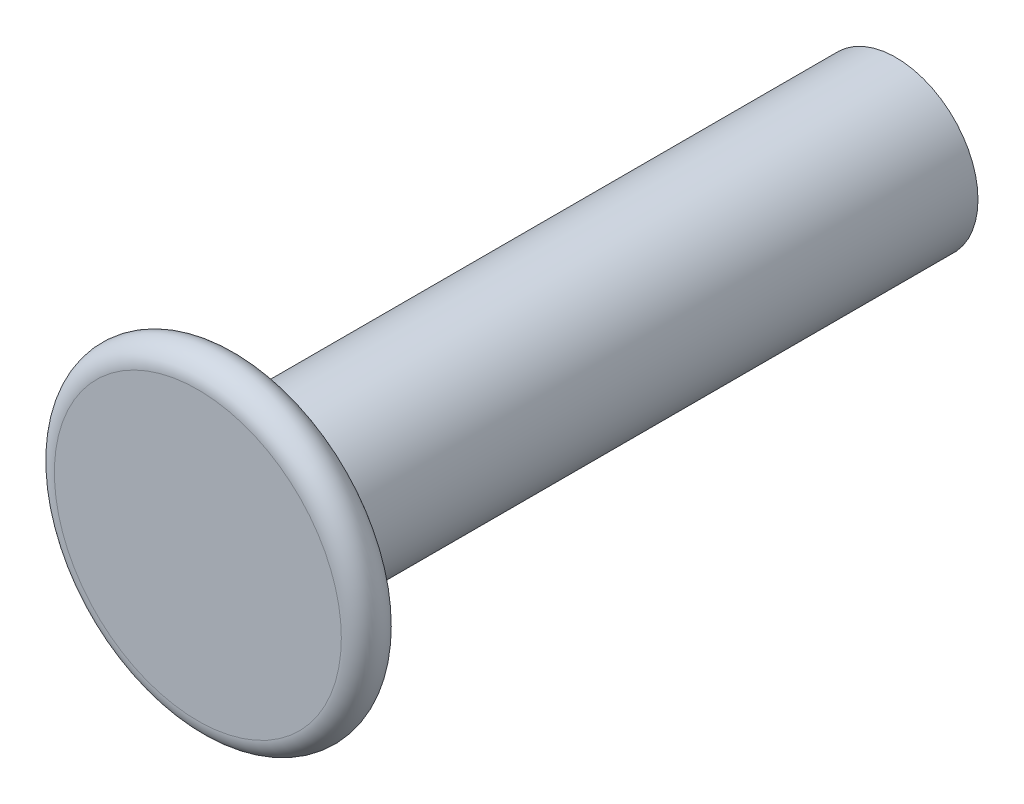
ISO-10303-21;
HEADER;
FILE_DESCRIPTION(('STEP AP214'),'2;1');
FILE_NAME('part.step','',(''),(''),'','','');
FILE_SCHEMA(('AUTOMOTIVE_DESIGN { 1 0 10303 214 1 1 1 1 }'));
ENDSEC;
DATA;
#1=APPLICATION_CONTEXT('core data for automotive mechanical design processes');
#2=APPLICATION_PROTOCOL_DEFINITION('international standard','automotive_design',2000,#1);
#3=PRODUCT_CONTEXT('',#1,'mechanical');
#4=PRODUCT('Part','Part','',(#3));
#5=PRODUCT_RELATED_PRODUCT_CATEGORY('part','',(#4));
#6=PRODUCT_DEFINITION_FORMATION('','',#4);
#7=PRODUCT_DEFINITION_CONTEXT('part definition',#1,'design');
#8=PRODUCT_DEFINITION('design','',#6,#7);
#9=PRODUCT_DEFINITION_SHAPE('','',#8);
#10=(LENGTH_UNIT() NAMED_UNIT(*) SI_UNIT(.MILLI.,.METRE.));
#11=(NAMED_UNIT(*) PLANE_ANGLE_UNIT() SI_UNIT($,.RADIAN.));
#12=(NAMED_UNIT(*) SI_UNIT($,.STERADIAN.) SOLID_ANGLE_UNIT());
#13=UNCERTAINTY_MEASURE_WITH_UNIT(LENGTH_MEASURE(1.E-05),#10,'distance_accuracy_value','');
#14=(GEOMETRIC_REPRESENTATION_CONTEXT(3) GLOBAL_UNCERTAINTY_ASSIGNED_CONTEXT((#13)) GLOBAL_UNIT_ASSIGNED_CONTEXT((#10,
#11,#12)) REPRESENTATION_CONTEXT('',''));
#15=CARTESIAN_POINT('',(0.,0.,0.));
#16=DIRECTION('',(0.,0.,1.));
#17=DIRECTION('',(1.,0.,0.));
#18=AXIS2_PLACEMENT_3D('',#15,#16,#17);
#19=CARTESIAN_POINT('',(0.,0.,-27.0002));
#20=DIRECTION('',(0.,0.,1.));
#21=DIRECTION('',(1.,0.,0.));
#22=AXIS2_PLACEMENT_3D('',#19,#20,#21);
#23=PLANE('',#22);
#24=CARTESIAN_POINT('',(0.,0.,-27.0002));
#25=DIRECTION('',(0.,0.,1.));
#26=DIRECTION('',(1.,0.,0.));
#27=AXIS2_PLACEMENT_3D('',#24,#25,#26);
#28=CIRCLE('',#27,3.175);
#29=CARTESIAN_POINT('',(3.175,0.,-27.0002));
#30=VERTEX_POINT('',#29);
#31=EDGE_CURVE('E10',#30,#30,#28,.T.);
#32=ORIENTED_EDGE('',*,*,#31,.F.);
#33=EDGE_LOOP('',(#32));
#34=FACE_BOUND('',#33,.T.);
#35=ADVANCED_FACE('F31',(#34),#23,.F.);
#36=CARTESIAN_POINT('',(0.,0.,0.));
#37=DIRECTION('',(0.,0.,1.));
#38=DIRECTION('',(1.,0.,0.));
#39=AXIS2_PLACEMENT_3D('',#36,#37,#38);
#40=CYLINDRICAL_SURFACE('',#39,3.175);
#41=CARTESIAN_POINT('',(0.,0.,-1.6002));
#42=DIRECTION('',(0.,0.,1.));
#43=DIRECTION('',(1.,0.,0.));
#44=AXIS2_PLACEMENT_3D('',#41,#42,#43);
#45=CIRCLE('',#44,3.175);
#46=CARTESIAN_POINT('',(3.175,0.,-1.6002));
#47=VERTEX_POINT('',#46);
#48=EDGE_CURVE('E37',#47,#47,#45,.T.);
#49=ORIENTED_EDGE('',*,*,#48,.F.);
#50=EDGE_LOOP('',(#49));
#51=FACE_BOUND('',#50,.T.);
#52=ORIENTED_EDGE('',*,*,#31,.T.);
#53=EDGE_LOOP('',(#52));
#54=FACE_BOUND('',#53,.T.);
#55=ADVANCED_FACE('F61',(#51,#54),#40,.T.);
#56=CARTESIAN_POINT('',(-5.5499,0.,-1.6002));
#57=DIRECTION('',(0.,0.,1.));
#58=DIRECTION('',(1.,0.,0.));
#59=AXIS2_PLACEMENT_3D('',#56,#57,#58);
#60=PLANE('',#59);
#61=CARTESIAN_POINT('',(0.,0.,-1.6002));
#62=DIRECTION('',(0.,0.,1.));
#63=DIRECTION('',(1.,0.,0.));
#64=AXIS2_PLACEMENT_3D('',#61,#62,#63);
#65=CIRCLE('',#64,5.5499);
#66=CARTESIAN_POINT('',(5.5499,0.,-1.6002));
#67=VERTEX_POINT('',#66);
#68=EDGE_CURVE('E41',#67,#67,#65,.T.);
#69=ORIENTED_EDGE('',*,*,#68,.F.);
#70=EDGE_LOOP('',(#69));
#71=FACE_BOUND('',#70,.T.);
#72=ORIENTED_EDGE('',*,*,#48,.T.);
#73=EDGE_LOOP('',(#72));
#74=FACE_BOUND('',#73,.T.);
#75=ADVANCED_FACE('F56',(#71,#74),#60,.F.);
#76=CARTESIAN_POINT('',(0.,0.,-0.8001));
#77=DIRECTION('',(0.,0.,1.));
#78=DIRECTION('',(1.,0.,0.));
#79=AXIS2_PLACEMENT_3D('',#76,#77,#78);
#80=TOROIDAL_SURFACE('',#79,5.5499,0.8001);
#81=CARTESIAN_POINT('',(0.,0.,0.));
#82=DIRECTION('',(0.,0.,1.));
#83=DIRECTION('',(1.,0.,0.));
#84=AXIS2_PLACEMENT_3D('',#81,#82,#83);
#85=CIRCLE('',#84,5.5499);
#86=CARTESIAN_POINT('',(5.5499,0.,0.));
#87=VERTEX_POINT('',#86);
#88=EDGE_CURVE('E45',#87,#87,#85,.T.);
#89=ORIENTED_EDGE('',*,*,#88,.F.);
#90=EDGE_LOOP('',(#89));
#91=FACE_BOUND('',#90,.T.);
#92=ORIENTED_EDGE('',*,*,#68,.T.);
#93=EDGE_LOOP('',(#92));
#94=FACE_BOUND('',#93,.T.);
#95=ADVANCED_FACE('F53',(#91,#94),#80,.T.);
#96=CARTESIAN_POINT('',(0.,0.,0.));
#97=DIRECTION('',(0.,0.,-1.));
#98=DIRECTION('',(-1.,0.,0.));
#99=AXIS2_PLACEMENT_3D('',#96,#97,#98);
#100=PLANE('',#99);
#101=ORIENTED_EDGE('',*,*,#88,.T.);
#102=EDGE_LOOP('',(#101));
#103=FACE_BOUND('',#102,.T.);
#104=ADVANCED_FACE('F51',(#103),#100,.F.);
#105=CLOSED_SHELL('',(#35,#55,#75,#95,#104));
#106=MANIFOLD_SOLID_BREP('B2',#105);
#107=ADVANCED_BREP_SHAPE_REPRESENTATION('',(#18,#106),#14);
#108=SHAPE_DEFINITION_REPRESENTATION(#9,#107);
ENDSEC;
END-ISO-10303-21;
